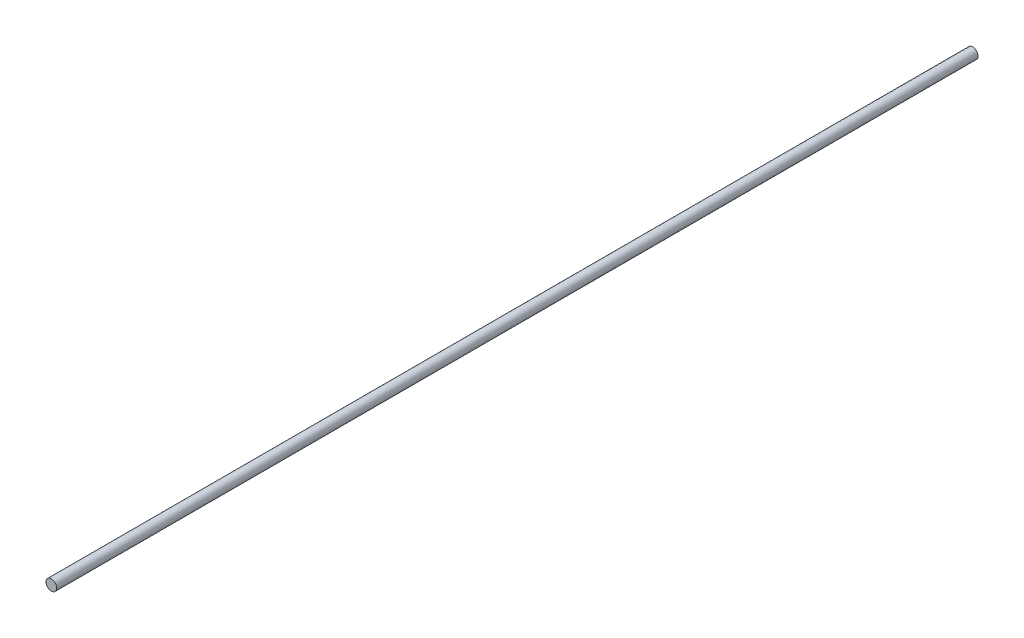
ISO-10303-21;
HEADER;
FILE_DESCRIPTION(('STEP AP214'),'2;1');
FILE_NAME('part.step','',(''),(''),'','','');
FILE_SCHEMA(('AUTOMOTIVE_DESIGN { 1 0 10303 214 1 1 1 1 }'));
ENDSEC;
DATA;
#1=APPLICATION_CONTEXT('core data for automotive mechanical design processes');
#2=APPLICATION_PROTOCOL_DEFINITION('international standard','automotive_design',2000,#1);
#3=PRODUCT_CONTEXT('',#1,'mechanical');
#4=PRODUCT('Part','Part','',(#3));
#5=PRODUCT_RELATED_PRODUCT_CATEGORY('part','',(#4));
#6=PRODUCT_DEFINITION_FORMATION('','',#4);
#7=PRODUCT_DEFINITION_CONTEXT('part definition',#1,'design');
#8=PRODUCT_DEFINITION('design','',#6,#7);
#9=PRODUCT_DEFINITION_SHAPE('','',#8);
#10=(LENGTH_UNIT() NAMED_UNIT(*) SI_UNIT(.MILLI.,.METRE.));
#11=(NAMED_UNIT(*) PLANE_ANGLE_UNIT() SI_UNIT($,.RADIAN.));
#12=(NAMED_UNIT(*) SI_UNIT($,.STERADIAN.) SOLID_ANGLE_UNIT());
#13=UNCERTAINTY_MEASURE_WITH_UNIT(LENGTH_MEASURE(1.E-05),#10,'distance_accuracy_value','');
#14=(GEOMETRIC_REPRESENTATION_CONTEXT(3) GLOBAL_UNCERTAINTY_ASSIGNED_CONTEXT((#13)) GLOBAL_UNIT_ASSIGNED_CONTEXT((#10,
#11,#12)) REPRESENTATION_CONTEXT('',''));
#15=CARTESIAN_POINT('',(0.,0.,0.));
#16=DIRECTION('',(0.,0.,1.));
#17=DIRECTION('',(1.,0.,0.));
#18=AXIS2_PLACEMENT_3D('',#15,#16,#17);
#19=CARTESIAN_POINT('',(0.,0.,520.));
#20=DIRECTION('',(0.,0.,-1.));
#21=DIRECTION('',(-1.,0.,0.));
#22=AXIS2_PLACEMENT_3D('',#19,#20,#21);
#23=CYLINDRICAL_SURFACE('',#22,3.);
#24=CARTESIAN_POINT('',(0.,0.,520.));
#25=DIRECTION('',(0.,0.,1.));
#26=DIRECTION('',(1.,0.,0.));
#27=AXIS2_PLACEMENT_3D('',#24,#25,#26);
#28=CIRCLE('',#27,3.);
#29=CARTESIAN_POINT('',(3.,0.,520.));
#30=VERTEX_POINT('',#29);
#31=EDGE_CURVE('E10',#30,#30,#28,.T.);
#32=ORIENTED_EDGE('',*,*,#31,.F.);
#33=EDGE_LOOP('',(#32));
#34=FACE_BOUND('',#33,.T.);
#35=CARTESIAN_POINT('',(0.,0.,0.));
#36=DIRECTION('',(0.,0.,1.));
#37=DIRECTION('',(1.,0.,0.));
#38=AXIS2_PLACEMENT_3D('',#35,#36,#37);
#39=CIRCLE('',#38,3.);
#40=CARTESIAN_POINT('',(3.,0.,0.));
#41=VERTEX_POINT('',#40);
#42=EDGE_CURVE('E36',#41,#41,#39,.T.);
#43=ORIENTED_EDGE('',*,*,#42,.T.);
#44=EDGE_LOOP('',(#43));
#45=FACE_BOUND('',#44,.T.);
#46=ADVANCED_FACE('F33',(#34,#45),#23,.T.);
#47=CARTESIAN_POINT('',(0.,0.,520.));
#48=DIRECTION('',(0.,0.,1.));
#49=DIRECTION('',(1.,0.,0.));
#50=AXIS2_PLACEMENT_3D('',#47,#48,#49);
#51=PLANE('',#50);
#52=ORIENTED_EDGE('',*,*,#31,.T.);
#53=EDGE_LOOP('',(#52));
#54=FACE_BOUND('',#53,.T.);
#55=ADVANCED_FACE('F48',(#54),#51,.T.);
#56=CARTESIAN_POINT('',(0.,0.,0.));
#57=DIRECTION('',(0.,0.,1.));
#58=DIRECTION('',(1.,0.,0.));
#59=AXIS2_PLACEMENT_3D('',#56,#57,#58);
#60=PLANE('',#59);
#61=ORIENTED_EDGE('',*,*,#42,.F.);
#62=EDGE_LOOP('',(#61));
#63=FACE_BOUND('',#62,.T.);
#64=ADVANCED_FACE('F46',(#63),#60,.F.);
#65=CLOSED_SHELL('',(#46,#55,#64));
#66=MANIFOLD_SOLID_BREP('B2',#65);
#67=ADVANCED_BREP_SHAPE_REPRESENTATION('',(#18,#66),#14);
#68=SHAPE_DEFINITION_REPRESENTATION(#9,#67);
ENDSEC;
END-ISO-10303-21;
